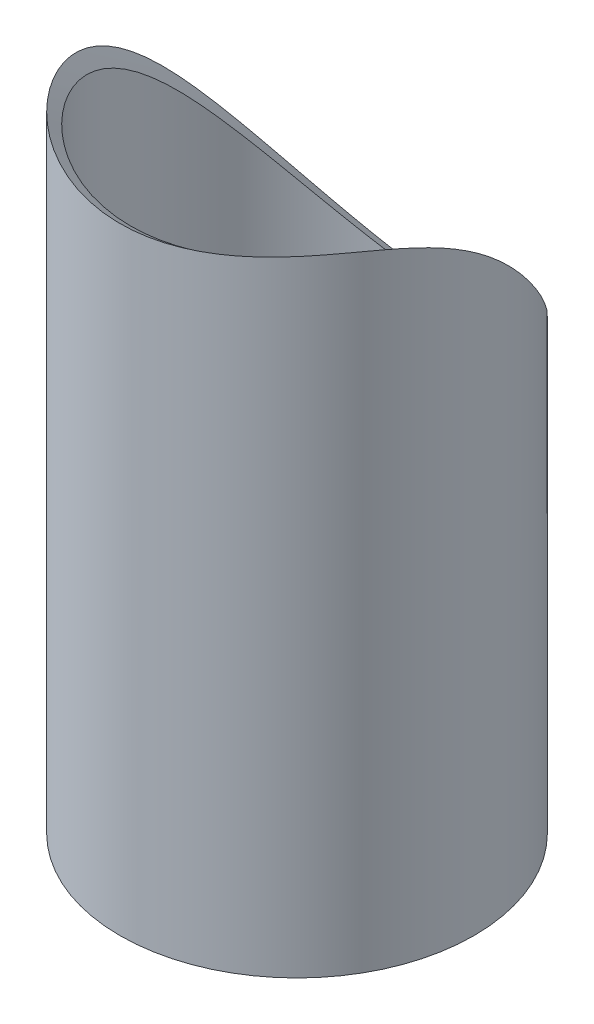
ISO-10303-21;
HEADER;
FILE_DESCRIPTION(('STEP AP214'),'2;1');
FILE_NAME('part.step','',(''),(''),'','','');
FILE_SCHEMA(('AUTOMOTIVE_DESIGN { 1 0 10303 214 1 1 1 1 }'));
ENDSEC;
DATA;
#1=APPLICATION_CONTEXT('core data for automotive mechanical design processes');
#2=APPLICATION_PROTOCOL_DEFINITION('international standard','automotive_design',2000,#1);
#3=PRODUCT_CONTEXT('',#1,'mechanical');
#4=PRODUCT('Part','Part','',(#3));
#5=PRODUCT_RELATED_PRODUCT_CATEGORY('part','',(#4));
#6=PRODUCT_DEFINITION_FORMATION('','',#4);
#7=PRODUCT_DEFINITION_CONTEXT('part definition',#1,'design');
#8=PRODUCT_DEFINITION('design','',#6,#7);
#9=PRODUCT_DEFINITION_SHAPE('','',#8);
#10=(LENGTH_UNIT() NAMED_UNIT(*) SI_UNIT(.MILLI.,.METRE.));
#11=(NAMED_UNIT(*) PLANE_ANGLE_UNIT() SI_UNIT($,.RADIAN.));
#12=(NAMED_UNIT(*) SI_UNIT($,.STERADIAN.) SOLID_ANGLE_UNIT());
#13=UNCERTAINTY_MEASURE_WITH_UNIT(LENGTH_MEASURE(1.E-05),#10,'distance_accuracy_value','');
#14=(GEOMETRIC_REPRESENTATION_CONTEXT(3) GLOBAL_UNCERTAINTY_ASSIGNED_CONTEXT((#13)) GLOBAL_UNIT_ASSIGNED_CONTEXT((#10,
#11,#12)) REPRESENTATION_CONTEXT('',''));
#15=CARTESIAN_POINT('',(0.,0.,0.));
#16=DIRECTION('',(0.,0.,1.));
#17=DIRECTION('',(1.,0.,0.));
#18=AXIS2_PLACEMENT_3D('',#15,#16,#17);
#19=CARTESIAN_POINT('',(0.,0.,0.));
#20=DIRECTION('',(0.,1.,0.));
#21=DIRECTION('',(0.,0.,1.));
#22=AXIS2_PLACEMENT_3D('',#19,#20,#21);
#23=PLANE('',#22);
#24=CARTESIAN_POINT('',(0.,0.,0.));
#25=DIRECTION('',(0.,1.,0.));
#26=DIRECTION('',(0.,0.,1.));
#27=AXIS2_PLACEMENT_3D('',#24,#25,#26);
#28=CIRCLE('',#27,50.);
#29=CARTESIAN_POINT('',(0.,0.,50.));
#30=VERTEX_POINT('',#29);
#31=EDGE_CURVE('E57',#30,#30,#28,.T.);
#32=ORIENTED_EDGE('',*,*,#31,.F.);
#33=EDGE_LOOP('',(#32));
#34=FACE_BOUND('',#33,.T.);
#35=CARTESIAN_POINT('',(0.,0.,0.));
#36=DIRECTION('',(0.,1.,0.));
#37=DIRECTION('',(1.,0.,0.));
#38=AXIS2_PLACEMENT_3D('',#35,#36,#37);
#39=CIRCLE('',#38,47.);
#40=CARTESIAN_POINT('',(47.,0.,0.));
#41=VERTEX_POINT('',#40);
#42=EDGE_CURVE('E91',#41,#41,#39,.T.);
#43=ORIENTED_EDGE('',*,*,#42,.T.);
#44=EDGE_LOOP('',(#43));
#45=FACE_BOUND('',#44,.T.);
#46=ADVANCED_FACE('F78',(#34,#45),#23,.F.);
#47=CARTESIAN_POINT('',(0.,200.,0.));
#48=DIRECTION('',(0.,-1.,0.));
#49=DIRECTION('',(0.,0.,-1.));
#50=AXIS2_PLACEMENT_3D('',#47,#48,#49);
#51=CYLINDRICAL_SURFACE('',#50,50.);
#52=CARTESIAN_POINT('',(0.,104.15792620832,-50.));
#53=CARTESIAN_POINT('',(0.788806087620831,104.157933799452,-49.9999955417674));
#54=CARTESIAN_POINT('',(1.57769231507761,104.188336058884,-49.9812892722332));
#55=CARTESIAN_POINT('',(3.14911275591625,104.309131673315,-49.9069348279691));
#56=CARTESIAN_POINT('',(3.93164621656736,104.399532035348,-49.8512823383784));
#57=CARTESIAN_POINT('',(5.48516003386601,104.638045510306,-49.704349147488));
#58=CARTESIAN_POINT('',(6.25612921699846,104.786211120958,-49.6130360372744));
#59=CARTESIAN_POINT('',(7.78082200161067,105.136617433011,-49.3968826605339));
#60=CARTESIAN_POINT('',(8.53454404154594,105.33886300991,-49.2720393711394));
#61=CARTESIAN_POINT('',(10.1952066274927,105.846289607741,-48.9584435091409));
#62=CARTESIAN_POINT('',(11.0966452274474,106.164486821358,-48.7615697936143));
#63=CARTESIAN_POINT('',(12.8625437496132,106.867499993301,-48.3257994361202));
#64=CARTESIAN_POINT('',(13.726994358212,107.252332608803,-48.0868922866094));
#65=CARTESIAN_POINT('',(15.4174811957132,108.080108257023,-47.571873890137));
#66=CARTESIAN_POINT('',(16.24346212476,108.523131646166,-47.2957111819302));
#67=CARTESIAN_POINT('',(17.8548987521452,109.458420523302,-46.7112129541796));
#68=CARTESIAN_POINT('',(18.6403523647394,109.950688541853,-46.4028757812355));
#69=CARTESIAN_POINT('',(20.5989758577776,111.263773647704,-45.5780501947243));
#70=CARTESIAN_POINT('',(21.7437560487012,112.114568236229,-45.0414667163745));
#71=CARTESIAN_POINT('',(23.39149036538,113.449130852108,-44.1952436385972));
#72=CARTESIAN_POINT('',(23.9293665131367,113.903909807969,-43.9061523277612));
#73=CARTESIAN_POINT('',(24.9829274408408,114.830716244766,-43.3153329849873));
#74=CARTESIAN_POINT('',(25.4986129229226,115.302743179085,-43.0136053534718));
#75=CARTESIAN_POINT('',(26.5096403489486,116.262874123129,-42.3979956931459));
#76=CARTESIAN_POINT('',(27.0049375673057,116.751009643886,-42.0840896013979));
#77=CARTESIAN_POINT('',(27.9749157834355,117.740561603372,-41.4456399895234));
#78=CARTESIAN_POINT('',(28.4495968455875,118.241978000619,-41.1210965026203));
#79=CARTESIAN_POINT('',(29.8438884402143,119.763515461215,-40.1327950505358));
#80=CARTESIAN_POINT('',(30.7340148415765,120.801181475351,-39.4542018023888));
#81=CARTESIAN_POINT('',(32.3460160725744,122.793786049916,-38.1404180357073));
#82=CARTESIAN_POINT('',(33.0755707246591,123.744980302077,-37.5088738251481));
#83=CARTESIAN_POINT('',(34.4815649600617,125.669560713067,-36.2205871664935));
#84=CARTESIAN_POINT('',(35.1579960980747,126.642950368797,-35.5638407364827));
#85=CARTESIAN_POINT('',(36.4614548483428,128.607339664232,-34.2262319568102));
#86=CARTESIAN_POINT('',(37.0884461936335,129.598351589709,-33.5453524251617));
#87=CARTESIAN_POINT('',(38.2953144038239,131.59286029552,-32.1607252099585));
#88=CARTESIAN_POINT('',(38.8751936272657,132.59635644796,-31.4569786736515));
#89=CARTESIAN_POINT('',(39.9911134663435,134.613624965565,-30.025584770355));
#90=CARTESIAN_POINT('',(40.5270797293347,135.627411621375,-29.2978996754105));
#91=CARTESIAN_POINT('',(41.5559132675181,137.659975256035,-27.8193679472551));
#92=CARTESIAN_POINT('',(42.0487795070729,138.678752354178,-27.0685207580752));
#93=CARTESIAN_POINT('',(42.9924310681288,140.717195304658,-25.5431937559186));
#94=CARTESIAN_POINT('',(43.4432370654812,141.73686046896,-24.7687258054707));
#95=CARTESIAN_POINT('',(44.3037488713321,143.773922794198,-23.1944523523802));
#96=CARTESIAN_POINT('',(44.7134566349924,144.79132006077,-22.3946480574448));
#97=CARTESIAN_POINT('',(45.3888867995645,146.551540742501,-20.9830514959319));
#98=CARTESIAN_POINT('',(45.6640218938514,147.295781946774,-20.3775109744298));
#99=CARTESIAN_POINT('',(46.1919351731326,148.779240456074,-19.1507466561188));
#100=CARTESIAN_POINT('',(46.4447139779447,149.518457899858,-18.5295232947235));
#101=CARTESIAN_POINT('',(46.9275691619725,150.990168125668,-17.2701518610891));
#102=CARTESIAN_POINT('',(47.1576406229409,151.722659419834,-16.6320001601032));
#103=CARTESIAN_POINT('',(47.5943613731987,153.178646023309,-15.3376435308361));
#104=CARTESIAN_POINT('',(47.8010106970172,153.902141345878,-14.6814386291709));
#105=CARTESIAN_POINT('',(48.1894229180066,155.335822180042,-13.3513396435347));
#106=CARTESIAN_POINT('',(48.3712503302447,156.046037888753,-12.6774970594271));
#107=CARTESIAN_POINT('',(48.7093929756601,157.452383031288,-11.3089302551525));
#108=CARTESIAN_POINT('',(48.8657073105735,158.148511968392,-10.6142053007789));
#109=CARTESIAN_POINT('',(49.1510873661007,159.523120913622,-9.2026552328283));
#110=CARTESIAN_POINT('',(49.2801661243535,160.201609229287,-8.48584088261945));
#111=CARTESIAN_POINT('',(49.5090519904965,161.53744413393,-7.02835855782333));
#112=CARTESIAN_POINT('',(49.6088628406405,162.194793416209,-6.28769364626892));
#113=CARTESIAN_POINT('',(49.7942865069198,163.619513155911,-4.6228204573585));
#114=CARTESIAN_POINT('',(49.8725220162403,164.381016526795,-3.69271790489871));
#115=CARTESIAN_POINT('',(49.9768594018136,165.858006820847,-1.79372269889005));
#116=CARTESIAN_POINT('',(50.0029658974672,166.573497815953,-0.824833490174102));
#117=CARTESIAN_POINT('',(49.9965035140777,167.947544066395,1.15059307381174));
#118=CARTESIAN_POINT('',(49.964015647843,168.606176615354,2.15707656720963));
#119=CARTESIAN_POINT('',(49.8332790523246,169.857092745435,4.20688215490948));
#120=CARTESIAN_POINT('',(49.7350319027653,170.449377920011,5.25020336369482));
#121=CARTESIAN_POINT('',(49.5321462920375,171.284226205382,6.8453956539696));
#122=CARTESIAN_POINT('',(49.4545298247245,171.555265654746,7.38601402107492));
#123=CARTESIAN_POINT('',(49.2797586831858,172.076634705024,8.47400719187578));
#124=CARTESIAN_POINT('',(49.1826065851463,172.326967030473,9.02138109578683));
#125=CARTESIAN_POINT('',(48.9680158406607,172.806067434162,10.1216415869975));
#126=CARTESIAN_POINT('',(48.8505748748339,173.034833042313,10.6745287977501));
#127=CARTESIAN_POINT('',(48.5948363482654,173.470126669494,11.7841406102277));
#128=CARTESIAN_POINT('',(48.4565416246534,173.676657706971,12.3408646801351));
#129=CARTESIAN_POINT('',(48.158665202145,174.067183079907,13.4564570766135));
#130=CARTESIAN_POINT('',(47.9990855855498,174.251179616543,14.0153251882449));
#131=CARTESIAN_POINT('',(47.6583943947968,174.596656756226,15.1333715890338));
#132=CARTESIAN_POINT('',(47.4772855057717,174.758140161665,15.6925498308713));
#133=CARTESIAN_POINT('',(47.0934292139373,175.058971698856,16.8094488369214));
#134=CARTESIAN_POINT('',(46.8906814123529,175.198319422559,17.36716957408));
#135=CARTESIAN_POINT('',(46.4636673191188,175.455534327552,18.4792468843422));
#136=CARTESIAN_POINT('',(46.2394017388811,175.573402218625,19.0336035680229));
#137=CARTESIAN_POINT('',(45.6073942182718,175.862835140424,20.518090769718));
#138=CARTESIAN_POINT('',(45.179813391309,176.015345571765,21.4436163002726));
#139=CARTESIAN_POINT('',(44.265726160029,176.267474479688,23.2721019005952));
#140=CARTESIAN_POINT('',(43.7792274382782,176.367099843088,24.1750648939097));
#141=CARTESIAN_POINT('',(42.7494105231099,176.520554029561,25.9527199456142));
#142=CARTESIAN_POINT('',(42.2060559292245,176.574353309765,26.8273934175326));
#143=CARTESIAN_POINT('',(41.065612392493,176.643370089826,28.5425375466609));
#144=CARTESIAN_POINT('',(40.4685185781078,176.658584088215,29.3830050930041));
#145=CARTESIAN_POINT('',(39.1577623322847,176.657556498294,31.1121783427853));
#146=CARTESIAN_POINT('',(38.4384491988533,176.637821602075,31.9965983989527));
#147=CARTESIAN_POINT('',(36.9417541202431,176.569008510519,33.7135602342094));
#148=CARTESIAN_POINT('',(36.1643699136105,176.519929171904,34.5460999906131));
#149=CARTESIAN_POINT('',(34.5552460844355,176.400540001356,36.1556391192293));
#150=CARTESIAN_POINT('',(33.723492254225,176.330224602577,36.9326238620515));
#151=CARTESIAN_POINT('',(32.009695445504,176.175527609188,38.4274984498727));
#152=CARTESIAN_POINT('',(31.1276489682791,176.091145035177,39.145384175013));
#153=CARTESIAN_POINT('',(29.1496540077315,175.898230000062,40.6461617693853));
#154=CARTESIAN_POINT('',(28.0443169432404,175.788117504747,41.4165186127912));
#155=CARTESIAN_POINT('',(25.775186410359,175.565788472139,42.8655142224368));
#156=CARTESIAN_POINT('',(24.6113869072692,175.453571718389,43.5441434934378));
#157=CARTESIAN_POINT('',(22.232020529706,175.234362612027,44.8057018928394));
#158=CARTESIAN_POINT('',(21.0164365353331,175.127372012668,45.3885990581966));
#159=CARTESIAN_POINT('',(18.5413788067582,174.924712175895,46.4546328392111));
#160=CARTESIAN_POINT('',(17.2819052064127,174.829042903957,46.9377697590904));
#161=CARTESIAN_POINT('',(14.6687793912857,174.649891362488,47.8206467640988));
#162=CARTESIAN_POINT('',(13.3134501198881,174.567162319319,48.2155880653107));
#163=CARTESIAN_POINT('',(10.5730948478505,174.423629766525,48.8896793999988));
#164=CARTESIAN_POINT('',(9.18806768094115,174.362827119651,49.1688248772529));
#165=CARTESIAN_POINT('',(6.39864475393267,174.266101012014,49.6089782747489));
#166=CARTESIAN_POINT('',(4.99425111286183,174.230174851017,49.7699990170195));
#167=CARTESIAN_POINT('',(2.17647112080676,174.184878279009,49.9725733513155));
#168=CARTESIAN_POINT('',(0.763085023084159,174.175507123396,50.0141302930977));
#169=CARTESIAN_POINT('',(-2.02989044626098,174.183654099159,49.9778505420562));
#170=CARTESIAN_POINT('',(-3.40951739897267,174.200565541333,49.9027076939287));
#171=CARTESIAN_POINT('',(-6.15727893492469,174.259406125772,49.6386224554472));
#172=CARTESIAN_POINT('',(-7.52541367240321,174.30133493173,49.4496815948703));
#173=CARTESIAN_POINT('',(-10.2403566387388,174.408313954667,48.9595527547789));
#174=CARTESIAN_POINT('',(-11.5871667915875,174.473362073165,48.6583749625988));
#175=CARTESIAN_POINT('',(-14.2502602057319,174.623537562984,47.9461144059484));
#176=CARTESIAN_POINT('',(-15.5665432520087,174.708665075687,47.5350308676081));
#177=CARTESIAN_POINT('',(-18.159388433091,174.894745439868,46.6061478583257));
#178=CARTESIAN_POINT('',(-19.4359580369043,174.995695293768,46.088368595287));
#179=CARTESIAN_POINT('',(-21.9414785184774,175.207999037452,44.9495781307964));
#180=CARTESIAN_POINT('',(-23.1704291938378,175.319352971451,44.3285664906252));
#181=CARTESIAN_POINT('',(-24.9723104114524,175.4890608978,43.322718261401));
#182=CARTESIAN_POINT('',(-25.5662976086193,175.546105332983,42.9748560712548));
#183=CARTESIAN_POINT('',(-26.7394020536535,175.660073504937,42.2549144486351));
#184=CARTESIAN_POINT('',(-27.3185206290451,175.716997252064,41.8828371887298));
#185=CARTESIAN_POINT('',(-28.4610320415076,175.82964780203,41.1150031680542));
#186=CARTESIAN_POINT('',(-29.0244232992112,175.885374484529,40.7192440415614));
#187=CARTESIAN_POINT('',(-30.1344867859855,175.994427048264,39.9047186341754));
#188=CARTESIAN_POINT('',(-30.6811605208082,176.047753145926,39.4859544349133));
#189=CARTESIAN_POINT('',(-31.7704653717313,176.151998764686,38.6152281566903));
#190=CARTESIAN_POINT('',(-32.3126504725804,176.202824262844,38.1626965841549));
#191=CARTESIAN_POINT('',(-33.3775875371785,176.299049127431,37.2348672374074));
#192=CARTESIAN_POINT('',(-33.9003414163442,176.344449029666,36.7595717177592));
#193=CARTESIAN_POINT('',(-34.9256588464126,176.428166503419,35.7868388609664));
#194=CARTESIAN_POINT('',(-35.4282176501832,176.466482417282,35.2893963751286));
#195=CARTESIAN_POINT('',(-36.4120218220591,176.534198885178,34.2733809743902));
#196=CARTESIAN_POINT('',(-36.8932696226555,176.563600458968,33.7548104841338));
#197=CARTESIAN_POINT('',(-37.8331124029048,176.611511102404,32.6979383670322));
#198=CARTESIAN_POINT('',(-38.2917289690973,176.6300307431,32.1596564304417));
#199=CARTESIAN_POINT('',(-39.1858033631913,176.654128284653,31.0640098955909));
#200=CARTESIAN_POINT('',(-39.6212640716302,176.659707798932,30.5066476851206));
#201=CARTESIAN_POINT('',(-40.4680442219523,176.655713309581,29.3740895941959));
#202=CARTESIAN_POINT('',(-40.8793689972355,176.646142666911,28.798897696888));
#203=CARTESIAN_POINT('',(-41.6769751152365,176.609549488259,27.6320339520034));
#204=CARTESIAN_POINT('',(-42.0632583877819,176.58252829887,27.0403633793947));
#205=CARTESIAN_POINT('',(-42.997024600386,176.49015025434,25.5416952014008));
#206=CARTESIAN_POINT('',(-43.5283014174462,176.412369094249,24.6252405389186));
#207=CARTESIAN_POINT('',(-44.52930726066,176.204255054766,22.7652390312741));
#208=CARTESIAN_POINT('',(-44.9990466216235,176.073931014633,21.8216967678291));
#209=CARTESIAN_POINT('',(-45.8739749929697,175.753845473489,19.9167021747052));
#210=CARTESIAN_POINT('',(-46.279266211031,175.564179529132,18.9552809596444));
#211=CARTESIAN_POINT('',(-47.0246688176025,175.119881244027,17.0221523589143));
#212=CARTESIAN_POINT('',(-47.3647798580827,174.865248556405,16.050444918351));
#213=CARTESIAN_POINT('',(-47.980394126267,174.287331559031,14.1041203176234));
#214=CARTESIAN_POINT('',(-48.2557366883598,173.96388024059,13.1295018707028));
#215=CARTESIAN_POINT('',(-48.7421591787028,173.248739956459,11.1893837401412));
#216=CARTESIAN_POINT('',(-48.9532403686805,172.857052330778,10.2238838778237));
#217=CARTESIAN_POINT('',(-49.3142949301225,172.008130089865,8.30964000438002));
#218=CARTESIAN_POINT('',(-49.4642196716415,171.550843701282,7.3609098993181));
#219=CARTESIAN_POINT('',(-49.7069730390854,170.576230413691,5.48722368023473));
#220=CARTESIAN_POINT('',(-49.7997935208653,170.058894963054,4.56227097533584));
#221=CARTESIAN_POINT('',(-49.9119917570652,169.144041827953,3.03008881831061));
#222=CARTESIAN_POINT('',(-49.9453346095449,168.76068915094,2.41529626403259));
#223=CARTESIAN_POINT('',(-49.9893142396565,167.97151571866,1.19939035912804));
#224=CARTESIAN_POINT('',(-49.9999489738231,167.565692944717,0.598278244396247));
#225=CARTESIAN_POINT('',(-50.0000506838378,166.733804959446,-0.589989158168888));
#226=CARTESIAN_POINT('',(-49.9895112502026,166.307733656945,-1.17714016549689));
#227=CARTESIAN_POINT('',(-49.9487128949025,165.43765443935,-2.33730925430218));
#228=CARTESIAN_POINT('',(-49.918452932714,164.993645578968,-2.91032658838194));
#229=CARTESIAN_POINT('',(-49.8394343531396,164.088452824575,-4.04409123021243));
#230=CARTESIAN_POINT('',(-49.7906209450293,163.627221744727,-4.60479694163562));
#231=CARTESIAN_POINT('',(-49.6757159614263,162.690776253443,-5.71255845651443));
#232=CARTESIAN_POINT('',(-49.6096244656777,162.215561906555,-6.25961432295588));
#233=CARTESIAN_POINT('',(-49.4612388066453,161.252957551168,-7.34053459079268));
#234=CARTESIAN_POINT('',(-49.3789463392611,160.76556882173,-7.87440036633424));
#235=CARTESIAN_POINT('',(-49.1990729997471,159.780137617634,-8.92959032602035));
#236=CARTESIAN_POINT('',(-49.101491261546,159.282094540835,-9.4509137977666));
#237=CARTESIAN_POINT('',(-48.8044539853181,157.857743836768,-10.9112748779076));
#238=CARTESIAN_POINT('',(-48.5878854620181,156.920523097241,-11.8362530444803));
#239=CARTESIAN_POINT('',(-48.1098723689423,155.022600416263,-13.649892809029));
#240=CARTESIAN_POINT('',(-47.8484196474602,154.061894236699,-14.5385477737546));
#241=CARTESIAN_POINT('',(-47.2830446815783,152.122482575444,-16.2835951595358));
#242=CARTESIAN_POINT('',(-46.9790897020511,151.143763729842,-17.1399620607397));
#243=CARTESIAN_POINT('',(-46.3305417966132,149.174253229564,-18.8226945375659));
#244=CARTESIAN_POINT('',(-45.9859512503074,148.183462284871,-19.6490618662504));
#245=CARTESIAN_POINT('',(-45.2563227658295,146.192367647275,-21.2758380681332));
#246=CARTESIAN_POINT('',(-44.8712145439872,145.192050255892,-22.0761985742574));
#247=CARTESIAN_POINT('',(-44.0612177361305,143.187493026138,-23.651500785595));
#248=CARTESIAN_POINT('',(-43.6363282901163,142.183253103419,-24.4264419407975));
#249=CARTESIAN_POINT('',(-42.7465914990555,140.174971007157,-25.9520372834627));
#250=CARTESIAN_POINT('',(-42.2817653120078,139.170929007927,-26.7027040445835));
#251=CARTESIAN_POINT('',(-41.3110213248911,137.165954775929,-28.1812282332321));
#252=CARTESIAN_POINT('',(-40.8051051037909,136.1650224252,-28.9090865357334));
#253=CARTESIAN_POINT('',(-39.8573266151665,134.371449473718,-30.1976353807184));
#254=CARTESIAN_POINT('',(-39.4231984363978,133.577617329488,-30.7623675216591));
#255=CARTESIAN_POINT('',(-38.5268773557228,131.99592783708,-31.877760862639));
#256=CARTESIAN_POINT('',(-38.0646848859339,131.208070397116,-32.4284222791457));
#257=CARTESIAN_POINT('',(-37.1109334967901,129.640054234845,-33.5156934619511));
#258=CARTESIAN_POINT('',(-36.6193665374846,128.859897689023,-34.0522993228312));
#259=CARTESIAN_POINT('',(-35.6056045232438,127.309636889387,-35.1109391444172));
#260=CARTESIAN_POINT('',(-35.083409630134,126.539532582486,-35.6329731820932));
#261=CARTESIAN_POINT('',(-34.0086251729488,125.014348983232,-36.6601159277301));
#262=CARTESIAN_POINT('',(-33.4561445573297,124.259227632373,-37.1652759775506));
#263=CARTESIAN_POINT('',(-32.3173764257223,122.76400646528,-38.1596464419038));
#264=CARTESIAN_POINT('',(-31.7310874765318,122.023907287667,-38.648856178893));
#265=CARTESIAN_POINT('',(-30.5230962977053,120.562334056215,-39.6097957567908));
#266=CARTESIAN_POINT('',(-29.9014154451542,119.840849133988,-40.0815358711885));
#267=CARTESIAN_POINT('',(-28.6202541200722,118.419844443168,-41.0061585794417));
#268=CARTESIAN_POINT('',(-27.960779398865,117.720321357452,-41.4590440245136));
#269=CARTESIAN_POINT('',(-26.5581268616089,116.303557433448,-42.3722840367263));
#270=CARTESIAN_POINT('',(-25.8122932482909,115.588047122757,-42.8312621593159));
#271=CARTESIAN_POINT('',(-24.2722732520713,114.193081631025,-43.7223986441013));
#272=CARTESIAN_POINT('',(-23.4780878860845,113.513625692264,-44.1545575699622));
#273=CARTESIAN_POINT('',(-21.8388098184927,112.198625252701,-44.9879058380867));
#274=CARTESIAN_POINT('',(-20.993726853853,111.56307240265,-45.3891010705667));
#275=CARTESIAN_POINT('',(-19.2504238350986,110.345189712321,-46.1554691424544));
#276=CARTESIAN_POINT('',(-18.3522145814093,109.762849114987,-46.5206492636404));
#277=CARTESIAN_POINT('',(-16.681878620467,108.769710059467,-47.1417728119527));
#278=CARTESIAN_POINT('',(-15.9192542207723,108.347588058411,-47.4051411682928));
#279=CARTESIAN_POINT('',(-14.3592073488131,107.551738597144,-47.9007598294011));
#280=CARTESIAN_POINT('',(-13.5617849094215,107.178011091218,-48.1330101635648));
#281=CARTESIAN_POINT('',(-11.9352405395693,106.486829917404,-48.5618795440931));
#282=CARTESIAN_POINT('',(-11.1061761050351,106.169279584881,-48.7585598095052));
#283=CARTESIAN_POINT('',(-9.41843016740397,105.597170250391,-49.1124805336938));
#284=CARTESIAN_POINT('',(-8.5597581881127,105.342591204013,-49.269733542792));
#285=CARTESIAN_POINT('',(-7.06570937799992,104.965823603158,-49.5022625527628));
#286=CARTESIAN_POINT('',(-6.4362358136836,104.826572353204,-49.5881348951697));
#287=CARTESIAN_POINT('',(-5.16736797707175,104.586089236067,-49.7363655019608));
#288=CARTESIAN_POINT('',(-4.52797534067521,104.484851167553,-49.7987276017268));
#289=CARTESIAN_POINT('',(-3.24231868441363,104.322141609754,-49.8989279916738));
#290=CARTESIAN_POINT('',(-2.59605571599866,104.260664122002,-49.9367699810735));
#291=CARTESIAN_POINT('',(-1.29988030652069,104.17855038617,-49.9873096121059));
#292=CARTESIAN_POINT('',(-0.649967359031493,104.157919953313,-50.0000036735336));
#293=CARTESIAN_POINT('',(0.,104.15792620832,-50.));
#294=B_SPLINE_CURVE_WITH_KNOTS('',3,(#52,#53,#54,#55,#56,#57,#58,#59,#60,#61,#62,#63,#64,#65,
#66,#67,#68,#69,#70,#71,#72,#73,#74,#75,#76,#77,#78,#79,#80,#81,#82,#83,#84,#85,#86,#87,#88,#89,
#90,#91,#92,#93,#94,#95,#96,#97,#98,#99,#100,#101,#102,#103,#104,#105,#106,#107,#108,#109,#110,
#111,#112,#113,#114,#115,#116,#117,#118,#119,#120,#121,#122,#123,#124,#125,#126,#127,#128,#129,
#130,#131,#132,#133,#134,#135,#136,#137,#138,#139,#140,#141,#142,#143,#144,#145,#146,#147,#148,
#149,#150,#151,#152,#153,#154,#155,#156,#157,#158,#159,#160,#161,#162,#163,#164,#165,#166,#167,
#168,#169,#170,#171,#172,#173,#174,#175,#176,#177,#178,#179,#180,#181,#182,#183,#184,#185,#186,
#187,#188,#189,#190,#191,#192,#193,#194,#195,#196,#197,#198,#199,#200,#201,#202,#203,#204,#205,
#206,#207,#208,#209,#210,#211,#212,#213,#214,#215,#216,#217,#218,#219,#220,#221,#222,#223,#224,
#225,#226,#227,#228,#229,#230,#231,#232,#233,#234,#235,#236,#237,#238,#239,#240,#241,#242,#243,
#244,#245,#246,#247,#248,#249,#250,#251,#252,#253,#254,#255,#256,#257,#258,#259,#260,#261,#262,
#263,#264,#265,#266,#267,#268,#269,#270,#271,#272,#273,#274,#275,#276,#277,#278,#279,#280,#281,
#282,#283,#284,#285,#286,#287,#288,#289,#290,#291,#292,#293),.UNSPECIFIED.,.T.,.F.,(4,2,2,2,2,2,
2,2,2,2,2,2,2,2,2,2,2,2,2,2,2,2,2,2,2,2,2,2,2,2,2,2,2,2,2,2,2,2,2,2,2,2,2,2,2,2,2,2,2,2,2,2,2,2,
2,2,2,2,2,2,2,2,2,2,2,2,2,2,2,2,2,2,2,2,2,2,2,2,2,2,2,2,2,2,2,2,2,2,2,2,2,2,2,2,2,2,2,2,2,2,2,2,
2,2,2,2,2,2,2,2,2,2,2,2,2,2,2,2,2,2,4),(0.,2.36576060984382,4.73179755983265,7.0999898229868,
9.46839565899208,12.3920072103036,15.3163506489009,18.2447756634522,21.1733512398045,
25.7371101218974,28.0208426897181,30.3045029448061,32.5929314848319,34.881352878129,
39.4569816899446,43.5203448943063,47.5843527692526,51.6513146204056,55.7180727444019,
59.791580144266,63.865185398341,67.9367774927602,72.0081757978183,75.0022318932966,
77.9962049539127,80.990825070963,83.9854407732407,86.9721185749402,89.9589015088547,
92.9442514131303,95.9292194379523,99.5407148006307,103.151890117263,106.75807643476,
110.364176124551,112.192740872776,114.021064644009,115.849597563835,117.677881937933,
119.505987581966,121.333865463237,123.161777035563,124.989628195031,128.078507454486,
131.166984374029,134.257450849636,137.348197763284,140.765500604298,144.182936594313,
147.601269213914,151.019839927879,155.070701756887,159.12198259285,163.17461333299,
167.227231714319,171.464371931973,175.701678852708,179.938525760451,184.17525386614,
188.315627133765,192.455944743945,196.595886644188,200.735857695425,204.875045365994,
209.014250627826,211.08590909915,213.157381957509,215.229062094204,217.300555081175,
219.424051462922,221.547337964649,223.671120689002,225.794660371339,227.916133756069,
230.037342613844,232.158080961825,234.278655679984,237.461729105481,240.644267267603,
243.821706823993,246.999163345864,250.184420694795,253.369615499365,256.557338169991,
259.745515364695,261.920583701722,264.095847761236,266.271770378834,268.447807814962,
270.630321937486,272.812825987157,274.995101696104,277.177501066274,281.17916799025,
285.181562452909,289.187056704844,293.192316512766,297.20464228627,301.217054819203,
305.227354580132,309.237500309917,312.436751932924,315.635954308203,318.836036368537,
322.036101522462,325.225326998846,328.414687772339,331.602142166148,334.789112786962,
338.180014788223,341.570845497997,344.961029572736,348.350526785844,351.080070978868,
353.809612593421,356.534410780784,359.258340517288,361.208035597993,363.157412474232,
365.106495189827,367.055855368219),.UNSPECIFIED.);
#295=CARTESIAN_POINT('',(0.,104.15792620832,-50.));
#296=VERTEX_POINT('',#295);
#297=EDGE_CURVE('E96',#296,#296,#294,.T.);
#298=ORIENTED_EDGE('',*,*,#297,.T.);
#299=EDGE_LOOP('',(#298));
#300=FACE_BOUND('',#299,.T.);
#301=ORIENTED_EDGE('',*,*,#31,.T.);
#302=EDGE_LOOP('',(#301));
#303=FACE_BOUND('',#302,.T.);
#304=ADVANCED_FACE('F85',(#300,#303),#51,.T.);
#305=CARTESIAN_POINT('',(0.,200.,0.));
#306=DIRECTION('',(0.,-1.,0.));
#307=DIRECTION('',(0.,0.,-1.));
#308=AXIS2_PLACEMENT_3D('',#305,#306,#307);
#309=CYLINDRICAL_SURFACE('',#308,47.);
#310=CARTESIAN_POINT('',(0.,106.25854882295,-47.));
#311=CARTESIAN_POINT('',(0.758875423841747,106.258543044184,-47.0000034847539));
#312=CARTESIAN_POINT('',(1.51770549365743,106.287459578877,-46.9815830936117));
#313=CARTESIAN_POINT('',(3.02918627871136,106.402313493078,-46.9083832245413));
#314=CARTESIAN_POINT('',(3.78183754870207,106.488245695579,-46.8536070477087));
#315=CARTESIAN_POINT('',(5.27590615461316,106.714958523195,-46.7089777788858));
#316=CARTESIAN_POINT('',(6.01731507165036,106.855778329209,-46.6190996296554));
#317=CARTESIAN_POINT('',(7.48364187791328,107.188830992194,-46.4062956209255));
#318=CARTESIAN_POINT('',(8.20855744557102,107.381071038979,-46.2833651398849));
#319=CARTESIAN_POINT('',(9.80489384451881,107.86314975413,-45.9746659087148));
#320=CARTESIAN_POINT('',(10.6710660715687,108.165293607449,-45.7809287651349));
#321=CARTESIAN_POINT('',(12.3679427989925,108.832835642297,-45.3519635986493));
#322=CARTESIAN_POINT('',(13.1986389161469,109.198248672734,-45.1167258355445));
#323=CARTESIAN_POINT('',(14.8231143906865,109.984255599701,-44.6094205384635));
#324=CARTESIAN_POINT('',(15.6168419915678,110.404923884676,-44.3373033388503));
#325=CARTESIAN_POINT('',(17.165324253112,111.293029686493,-43.7611051390066));
#326=CARTESIAN_POINT('',(17.9200767077926,111.760469846221,-43.4570223324824));
#327=CARTESIAN_POINT('',(19.7940701674992,113.002056797601,-42.6466135161116));
#328=CARTESIAN_POINT('',(20.8865952241632,113.803993299434,-42.1207190350094));
#329=CARTESIAN_POINT('',(22.4591896154082,115.061546374397,-41.2908741056817));
#330=CARTESIAN_POINT('',(22.9725466188283,115.490020163247,-41.0073042599329));
#331=CARTESIAN_POINT('',(23.9780403944887,116.363087997732,-40.4275923085119));
#332=CARTESIAN_POINT('',(24.4701778201027,116.807681546245,-40.1314505904992));
#333=CARTESIAN_POINT('',(25.9179293223402,118.164473072086,-39.2244922274543));
#334=CARTESIAN_POINT('',(26.8427916616511,119.097988570044,-38.5962574900727));
#335=CARTESIAN_POINT('',(28.6164252632203,121.007964975906,-37.3002197543856));
#336=CARTESIAN_POINT('',(29.4652041069348,121.984421590391,-36.6324207095651));
#337=CARTESIAN_POINT('',(30.9806487358947,123.833437596236,-35.3559149428274));
#338=CARTESIAN_POINT('',(31.656299377512,124.701794608244,-34.7517291143477));
#339=CARTESIAN_POINT('',(32.958869011394,126.457673107473,-33.5189088943861));
#340=CARTESIAN_POINT('',(33.5857808441917,127.345197385885,-32.89027093129));
#341=CARTESIAN_POINT('',(34.7939675734967,129.135303079014,-31.6094190417952));
#342=CARTESIAN_POINT('',(35.3752109438404,130.037894382697,-30.9571892751488));
#343=CARTESIAN_POINT('',(36.493876017911,131.853496806358,-29.6302214575146));
#344=CARTESIAN_POINT('',(37.0312997508615,132.766507441598,-28.9554844508457));
#345=CARTESIAN_POINT('',(38.0649257577193,134.600680003607,-27.5826170016003));
#346=CARTESIAN_POINT('',(38.5610679152081,135.521851728871,-26.8844544506659));
#347=CARTESIAN_POINT('',(39.5126354351384,137.367661332331,-25.4653005168851));
#348=CARTESIAN_POINT('',(39.9680598149764,138.292299293613,-24.744308583687));
#349=CARTESIAN_POINT('',(40.8388231674038,140.141227095759,-23.2790988634767));
#350=CARTESIAN_POINT('',(41.2541810876725,141.065516893227,-22.534892277368));
#351=CARTESIAN_POINT('',(42.0453770208161,142.910743301394,-21.0217790707386));
#352=CARTESIAN_POINT('',(42.4212170474391,143.831680080644,-20.2528737114242));
#353=CARTESIAN_POINT('',(43.0409338731663,145.428922034043,-18.8913522181881));
#354=CARTESIAN_POINT('',(43.2937774993708,146.106809715435,-18.3046558462995));
#355=CARTESIAN_POINT('',(43.7773026221931,147.457126195194,-17.1160585234335));
#356=CARTESIAN_POINT('',(44.0079847999528,148.129555160755,-16.5141580404798));
#357=CARTESIAN_POINT('',(44.4466982328725,149.467318673619,-15.2941592613782));
#358=CARTESIAN_POINT('',(44.6547254413864,150.132651934399,-14.6760580958362));
#359=CARTESIAN_POINT('',(45.0473071789681,151.454137591448,-13.4227914140235));
#360=CARTESIAN_POINT('',(45.231861717077,152.110289991253,-12.7876259043258));
#361=CARTESIAN_POINT('',(45.5759934298986,153.409463991369,-11.5009196829512));
#362=CARTESIAN_POINT('',(45.7356360673891,154.052516008929,-10.8494272943413));
#363=CARTESIAN_POINT('',(46.0292050909342,155.324824840523,-9.52737145301814));
#364=CARTESIAN_POINT('',(46.1631306999261,155.954081237202,-8.85680742474112));
#365=CARTESIAN_POINT('',(46.4035432588379,157.19569895843,-7.49589486871992));
#366=CARTESIAN_POINT('',(46.5100419965524,157.808067439851,-6.80555498268156));
#367=CARTESIAN_POINT('',(46.6936381214816,159.012910591151,-5.40403192555332));
#368=CARTESIAN_POINT('',(46.7707388907036,159.605387542239,-4.69285116218692));
#369=CARTESIAN_POINT('',(46.9103065150236,160.929498861694,-3.04684665636245));
#370=CARTESIAN_POINT('',(46.9626468045499,161.65369917236,-2.10511227352963));
#371=CARTESIAN_POINT('',(47.0094276562105,163.055358827107,-0.18600571229314));
#372=CARTESIAN_POINT('',(47.003874311355,163.732823082366,0.791362705020982));
#373=CARTESIAN_POINT('',(46.9282935857182,165.031157514934,2.77904845762528));
#374=CARTESIAN_POINT('',(46.8583480903172,165.652098469272,3.7893223744701));
#375=CARTESIAN_POINT('',(46.6471247973509,166.829298350582,5.84013971742074));
#376=CARTESIAN_POINT('',(46.5058485322807,167.38555866686,6.88068249276726));
#377=CARTESIAN_POINT('',(46.2346670742823,168.168335857716,8.46447696777825));
#378=CARTESIAN_POINT('',(46.1336172806651,168.422004940979,8.99947623369609));
#379=CARTESIAN_POINT('',(45.910951733389,168.909943954395,10.0739952662216));
#380=CARTESIAN_POINT('',(45.7893385841046,169.144216335574,10.6135144521618));
#381=CARTESIAN_POINT('',(45.524937860091,169.592788669213,11.6957418663343));
#382=CARTESIAN_POINT('',(45.3821475637141,169.80708604875,12.2384504958455));
#383=CARTESIAN_POINT('',(45.0749820150999,170.215297559656,13.3253463343336));
#384=CARTESIAN_POINT('',(44.9106095546435,170.409214321547,13.8695333431722));
#385=CARTESIAN_POINT('',(44.5599590183053,170.776626503282,14.9578383586794));
#386=CARTESIAN_POINT('',(44.3736778879248,170.950119068828,15.5019563451134));
#387=CARTESIAN_POINT('',(43.9791377740172,171.276815588314,16.5882285189456));
#388=CARTESIAN_POINT('',(43.7708814106359,171.430021956113,17.130382932509));
#389=CARTESIAN_POINT('',(43.3324083705378,171.716624099999,18.2110503900843));
#390=CARTESIAN_POINT('',(43.1021913869262,171.850019599166,18.7495633830953));
#391=CARTESIAN_POINT('',(42.6200282849265,172.097689508959,19.8211645659637));
#392=CARTESIAN_POINT('',(42.3680828038058,172.211964480076,20.3542529144061));
#393=CARTESIAN_POINT('',(41.6532851282343,172.498142664832,21.7953692438544));
#394=CARTESIAN_POINT('',(41.1693366484629,172.652193934171,22.696618206285));
#395=CARTESIAN_POINT('',(40.1403968700594,172.912009399898,24.4703960623371));
#396=CARTESIAN_POINT('',(39.5954127579626,173.017779273668,25.3429283215372));
#397=CARTESIAN_POINT('',(38.4470422828152,173.187757325531,27.0533999023575));
#398=CARTESIAN_POINT('',(37.843630518992,173.251947333142,27.8913239505743));
#399=CARTESIAN_POINT('',(36.5819041139855,173.345569907321,29.5267898694311));
#400=CARTESIAN_POINT('',(35.9235848801693,173.374999563295,30.3243283531113));
#401=CARTESIAN_POINT('',(34.4925047530828,173.407244249259,31.9459162135175));
#402=CARTESIAN_POINT('',(33.7147876734668,173.407359583787,32.7656465010902));
#403=CARTESIAN_POINT('',(32.1025804409826,173.382337043868,34.3467521634286));
#404=CARTESIAN_POINT('',(31.2680882635931,173.357198268452,35.1081254552037));
#405=CARTESIAN_POINT('',(29.5466796818819,173.289037496894,36.5686769275149));
#406=CARTESIAN_POINT('',(28.659749426106,173.246010757401,37.2678385516404));
#407=CARTESIAN_POINT('',(26.8382785472131,173.148590854093,38.6002633825548));
#408=CARTESIAN_POINT('',(25.9037351777931,173.094197034067,39.2335227817085));
#409=CARTESIAN_POINT('',(23.8595079368869,172.971806707354,40.513852583558));
#410=CARTESIAN_POINT('',(22.7434720174042,172.902969246887,41.1507304959244));
#411=CARTESIAN_POINT('',(20.462972017826,172.765030695511,42.3310231624023));
#412=CARTESIAN_POINT('',(19.2985039716678,172.695929583436,42.8744302434856));
#413=CARTESIAN_POINT('',(16.9284410228659,172.563276705691,43.8643065265776));
#414=CARTESIAN_POINT('',(15.722837195019,172.499726155108,44.3107545346842));
#415=CARTESIAN_POINT('',(13.2786720226161,172.382844960179,45.1035198464184));
#416=CARTESIAN_POINT('',(12.0401108987233,172.329514247425,45.4498378202747));
#417=CARTESIAN_POINT('',(9.5023217820259,172.235271504517,46.0483859218808));
#418=CARTESIAN_POINT('',(8.20237295294626,172.194759985271,46.2976292421947));
#419=CARTESIAN_POINT('',(5.58563945562132,172.130945364602,46.6856526627996));
#420=CARTESIAN_POINT('',(4.26885434731792,172.107642713914,46.8244298697621));
#421=CARTESIAN_POINT('',(1.62815907776112,172.079709445796,46.990415611529));
#422=CARTESIAN_POINT('',(0.304249416058805,172.075077535883,47.0176318691492));
#423=CARTESIAN_POINT('',(-2.34105957274758,172.084768855595,46.9602985421254));
#424=CARTESIAN_POINT('',(-3.6624589389383,172.099091787619,46.8757507122314));
#425=CARTESIAN_POINT('',(-6.27531066575718,172.145485723038,46.5974596374177));
#426=CARTESIAN_POINT('',(-7.56692643505117,172.177314356451,46.4052069270757));
#427=CARTESIAN_POINT('',(-10.1292126365695,172.256569346344,45.9140579202865));
#428=CARTESIAN_POINT('',(-11.3998832234678,172.303995587586,45.6151624117338));
#429=CARTESIAN_POINT('',(-13.9115164088029,172.411336486429,44.9129163742365));
#430=CARTESIAN_POINT('',(-15.1524782665466,172.471251455037,44.5095632439283));
#431=CARTESIAN_POINT('',(-17.5961791094729,172.599285267569,43.6013069145013));
#432=CARTESIAN_POINT('',(-18.79891766051,172.667404204633,43.0964025624269));
#433=CARTESIAN_POINT('',(-21.1671008113205,172.806891115658,41.9842500725323));
#434=CARTESIAN_POINT('',(-22.3322007266693,172.878279517792,41.3762673432849));
#435=CARTESIAN_POINT('',(-24.0385025413255,172.982176317979,40.3928448284476));
#436=CARTESIAN_POINT('',(-24.6004542648753,173.016282170296,40.0530766692538));
#437=CARTESIAN_POINT('',(-25.7097036822096,173.082415002784,39.3502482445905));
#438=CARTESIAN_POINT('',(-26.2570027636781,173.114442180228,38.9871901959375));
#439=CARTESIAN_POINT('',(-27.3364555360667,173.175352048372,38.2380726902932));
#440=CARTESIAN_POINT('',(-27.8685965476491,173.204232160559,37.8519947669952));
#441=CARTESIAN_POINT('',(-28.9163073277079,173.257619715162,37.0577822442522));
#442=CARTESIAN_POINT('',(-29.4318787293729,173.282127589618,36.6496498293135));
#443=CARTESIAN_POINT('',(-30.4456445708754,173.325483081487,35.8119413996568));
#444=CARTESIAN_POINT('',(-30.9438370457083,173.344330060653,35.3823629733403));
#445=CARTESIAN_POINT('',(-31.9218241587532,173.374964544277,34.5026042322902));
#446=CARTESIAN_POINT('',(-32.4016207372802,173.386752795184,34.0524261013668));
#447=CARTESIAN_POINT('',(-33.3430121883987,173.401798326645,33.1312269965408));
#448=CARTESIAN_POINT('',(-33.804564196428,173.40503657145,32.6601618848009));
#449=CARTESIAN_POINT('',(-34.7073727999574,173.401332995398,31.6990992126594));
#450=CARTESIAN_POINT('',(-35.1486317430246,173.394392355136,31.2091038542981));
#451=CARTESIAN_POINT('',(-36.0100803628857,173.368654611158,30.2110694720423));
#452=CARTESIAN_POINT('',(-36.4302663912674,173.349855461941,29.7030273494938));
#453=CARTESIAN_POINT('',(-37.2485376169757,173.298660629869,28.6702014452666));
#454=CARTESIAN_POINT('',(-37.6466256700567,173.266266708539,28.1454198407231));
#455=CARTESIAN_POINT('',(-38.4192506884678,173.186170011122,27.081226402941));
#456=CARTESIAN_POINT('',(-38.7938250139236,173.138492294992,26.5418398329552));
#457=CARTESIAN_POINT('',(-39.5192391983952,173.026051400039,25.4491591350411));
#458=CARTESIAN_POINT('',(-39.8700823067008,172.961290566219,24.8958669253663));
#459=CARTESIAN_POINT('',(-40.5472748936616,172.812968934512,23.7770070488892));
#460=CARTESIAN_POINT('',(-40.8736266271736,172.729409870168,23.2114405183476));
#461=CARTESIAN_POINT('',(-41.501165988243,172.541878737053,22.0698309034077));
#462=CARTESIAN_POINT('',(-41.8023545552402,172.437907430838,21.4937882111043));
#463=CARTESIAN_POINT('',(-42.3464932045613,172.221073582794,20.3986543130807));
#464=CARTESIAN_POINT('',(-42.5921812537781,172.110533743362,19.8804613640141));
#465=CARTESIAN_POINT('',(-43.0630216473173,171.871404706348,18.8388647661079));
#466=CARTESIAN_POINT('',(-43.2881721703015,171.742813910508,18.3154606596816));
#467=CARTESIAN_POINT('',(-43.7176782004699,171.466964925714,17.2651801618266));
#468=CARTESIAN_POINT('',(-43.9220379124644,171.31971052494,16.7383044955416));
#469=CARTESIAN_POINT('',(-44.3099827559623,171.006060267276,15.6825302989475));
#470=CARTESIAN_POINT('',(-44.4935655109707,170.839662225092,15.1536315443731));
#471=CARTESIAN_POINT('',(-44.8399332883724,170.487627003787,14.0957443863595));
#472=CARTESIAN_POINT('',(-45.0027284779695,170.301999310986,13.5667561544385));
#473=CARTESIAN_POINT('',(-45.307882661826,169.91146346137,12.5099291327596));
#474=CARTESIAN_POINT('',(-45.4502390638483,169.706552864365,11.9820904971501));
#475=CARTESIAN_POINT('',(-45.7148547730646,169.277783053339,10.9291658131564));
#476=CARTESIAN_POINT('',(-45.8371168032904,169.053926412977,10.404079401164));
#477=CARTESIAN_POINT('',(-46.0620882051115,168.587753360058,9.35790731192383));
#478=CARTESIAN_POINT('',(-46.1647956167753,168.345435100523,8.83682204072258));
#479=CARTESIAN_POINT('',(-46.4224039109019,167.651319893332,7.40422684608093));
#480=CARTESIAN_POINT('',(-46.5573536595793,167.180732797457,6.49811167980246));
#481=CARTESIAN_POINT('',(-46.7723532944383,166.18936118966,4.70750297383448));
#482=CARTESIAN_POINT('',(-46.8524092688904,165.668582251826,3.82300704685126));
#483=CARTESIAN_POINT('',(-46.9621561396799,164.582394327787,2.07846033600661));
#484=CARTESIAN_POINT('',(-46.9918343035881,164.016974096771,1.21841578594486));
#485=CARTESIAN_POINT('',(-47.005229153153,162.847535080874,-0.47540731422278));
#486=CARTESIAN_POINT('',(-46.9889394144524,162.243510912335,-1.30918217647721));
#487=CARTESIAN_POINT('',(-46.9180501392555,161.061530099955,-2.87213051004339));
#488=CARTESIAN_POINT('',(-46.8672282612637,160.486529561217,-3.60372767986657));
#489=CARTESIAN_POINT('',(-46.7340136971984,159.31351071428,-5.04540544748529));
#490=CARTESIAN_POINT('',(-46.6516158929281,158.71548868863,-5.75548253690807));
#491=CARTESIAN_POINT('',(-46.4575476502592,157.499697131948,-7.15512025652356));
#492=CARTESIAN_POINT('',(-46.3458590913416,156.881915585283,-7.84466789124039));
#493=CARTESIAN_POINT('',(-46.0952213009038,155.630141305434,-9.20369437373522));
#494=CARTESIAN_POINT('',(-45.9562731923419,154.996149240978,-9.87317404690459));
#495=CARTESIAN_POINT('',(-45.6519752831293,153.711501122532,-11.1964444297481));
#496=CARTESIAN_POINT('',(-45.4864965488931,153.060777433923,-11.8501396004948));
#497=CARTESIAN_POINT('',(-45.1309526618136,151.748235027831,-13.1394161887962));
#498=CARTESIAN_POINT('',(-44.9408874817424,151.086416298061,-13.7749975862901));
#499=CARTESIAN_POINT('',(-44.5372288087285,149.754043709082,-15.0289379977867));
#500=CARTESIAN_POINT('',(-44.3236410845127,149.083492026974,-15.6473011880263));
#501=CARTESIAN_POINT('',(-43.873630108558,147.735434252763,-16.867946836407));
#502=CARTESIAN_POINT('',(-43.6372058729592,147.057927862155,-17.4702286002875));
#503=CARTESIAN_POINT('',(-43.0210642749577,145.365443812714,-18.9501445920699));
#504=CARTESIAN_POINT('',(-42.6277713128967,144.347303500805,-19.8185480618653));
#505=CARTESIAN_POINT('',(-41.7925122650465,142.304762130971,-21.5241141723279));
#506=CARTESIAN_POINT('',(-41.3505419352287,141.280360534511,-22.3612740804329));
#507=CARTESIAN_POINT('',(-40.4174532882662,139.229332882127,-24.0067640238646));
#508=CARTESIAN_POINT('',(-39.9262977049051,138.202705724993,-24.8150715599692));
#509=CARTESIAN_POINT('',(-38.8942018512085,136.152644001662,-26.4033709166132));
#510=CARTESIAN_POINT('',(-38.3532637168085,135.129209300438,-27.1833639499946));
#511=CARTESIAN_POINT('',(-37.2224996939394,133.094835603963,-28.7121099657372));
#512=CARTESIAN_POINT('',(-36.6329116256995,132.08386069993,-29.4609908127003));
#513=CARTESIAN_POINT('',(-35.4002363866853,130.074389138038,-30.9312734886138));
#514=CARTESIAN_POINT('',(-34.7571449119485,129.07589349149,-31.652673100079));
#515=CARTESIAN_POINT('',(-33.4151262984779,127.098008702835,-33.0662687879401));
#516=CARTESIAN_POINT('',(-32.7162626489036,126.118599370808,-33.7584967379385));
#517=CARTESIAN_POINT('',(-31.2583814243733,124.184237866061,-35.1127230546764));
#518=CARTESIAN_POINT('',(-30.499379451845,123.229279434261,-35.7747291924384));
#519=CARTESIAN_POINT('',(-29.0767741793226,121.541344057261,-36.9351380985949));
#520=CARTESIAN_POINT('',(-28.4249542821017,120.80255788132,-37.439535096374));
#521=CARTESIAN_POINT('',(-27.0775099149217,119.34999201264,-38.4253215111309));
#522=CARTESIAN_POINT('',(-26.3818893416688,118.636210104178,-38.9067129681021));
#523=CARTESIAN_POINT('',(-24.9433391958589,117.238538156578,-39.844292843106));
#524=CARTESIAN_POINT('',(-24.2003641366216,116.554677955312,-40.3004562182193));
#525=CARTESIAN_POINT('',(-22.6648888020337,115.224418119241,-41.1835794392179));
#526=CARTESIAN_POINT('',(-21.8723871154421,114.578019552901,-41.6105384522102));
#527=CARTESIAN_POINT('',(-20.2251868420082,113.323314738727,-42.4358439471836));
#528=CARTESIAN_POINT('',(-19.3698400594968,112.715578712201,-42.8337710809512));
#529=CARTESIAN_POINT('',(-17.6037635524482,111.557454206703,-43.5893313625159));
#530=CARTESIAN_POINT('',(-16.6930278824796,111.007071901334,-43.946960172904));
#531=CARTESIAN_POINT('',(-14.8179175479106,109.977261614897,-44.6140940383326));
#532=CARTESIAN_POINT('',(-13.8536607682228,109.497685592371,-44.9236995708454));
#533=CARTESIAN_POINT('',(-11.8722902143754,108.622353961028,-45.48744712916));
#534=CARTESIAN_POINT('',(-10.8552031798747,108.226556453358,-45.7416168811448));
#535=CARTESIAN_POINT('',(-9.03464191890708,107.620103524695,-46.1303835013674));
#536=CARTESIAN_POINT('',(-8.2413072444094,107.387898839471,-46.2789886208657));
#537=CARTESIAN_POINT('',(-6.63287608353999,106.984758186935,-46.5367356422085));
#538=CARTESIAN_POINT('',(-5.81778281036124,106.813813226311,-46.6458833366719));
#539=CARTESIAN_POINT('',(-4.17299035448006,106.53832872569,-46.821674954607));
#540=CARTESIAN_POINT('',(-3.34331224253458,106.433700370916,-46.8883757257727));
#541=CARTESIAN_POINT('',(-1.67573725648184,106.293816139589,-46.9775347112692));
#542=CARTESIAN_POINT('',(-0.837840986329155,106.258555203031,-46.9999961526364));
#543=CARTESIAN_POINT('',(0.,106.25854882295,-47.));
#544=B_SPLINE_CURVE_WITH_KNOTS('',3,(#310,#311,#312,#313,#314,#315,#316,#317,#318,#319,#320,
#321,#322,#323,#324,#325,#326,#327,#328,#329,#330,#331,#332,#333,#334,#335,#336,#337,#338,#339,
#340,#341,#342,#343,#344,#345,#346,#347,#348,#349,#350,#351,#352,#353,#354,#355,#356,#357,#358,
#359,#360,#361,#362,#363,#364,#365,#366,#367,#368,#369,#370,#371,#372,#373,#374,#375,#376,#377,
#378,#379,#380,#381,#382,#383,#384,#385,#386,#387,#388,#389,#390,#391,#392,#393,#394,#395,#396,
#397,#398,#399,#400,#401,#402,#403,#404,#405,#406,#407,#408,#409,#410,#411,#412,#413,#414,#415,
#416,#417,#418,#419,#420,#421,#422,#423,#424,#425,#426,#427,#428,#429,#430,#431,#432,#433,#434,
#435,#436,#437,#438,#439,#440,#441,#442,#443,#444,#445,#446,#447,#448,#449,#450,#451,#452,#453,
#454,#455,#456,#457,#458,#459,#460,#461,#462,#463,#464,#465,#466,#467,#468,#469,#470,#471,#472,
#473,#474,#475,#476,#477,#478,#479,#480,#481,#482,#483,#484,#485,#486,#487,#488,#489,#490,#491,
#492,#493,#494,#495,#496,#497,#498,#499,#500,#501,#502,#503,#504,#505,#506,#507,#508,#509,#510,
#511,#512,#513,#514,#515,#516,#517,#518,#519,#520,#521,#522,#523,#524,#525,#526,#527,#528,#529,
#530,#531,#532,#533,#534,#535,#536,#537,#538,#539,#540,#541,#542,#543),.UNSPECIFIED.,.T.,.F.,(4,
2,2,2,2,2,2,2,2,2,2,2,2,2,2,2,2,2,2,2,2,2,2,2,2,2,2,2,2,2,2,2,2,2,2,2,2,2,2,2,2,2,2,2,2,2,2,2,2,
2,2,2,2,2,2,2,2,2,2,2,2,2,2,2,2,2,2,2,2,2,2,2,2,2,2,2,2,2,2,2,2,2,2,2,2,2,2,2,2,2,2,2,2,2,2,2,2,
2,2,2,2,2,2,2,2,2,2,2,2,2,2,2,2,2,2,2,4),(0.,2.27578423339585,4.55136185445877,6.82856685478702,
9.10609043095641,11.9146266829556,14.7238229777244,17.5368407299236,20.3500175240111,
24.7036014129572,26.88212769578,29.0605868514566,33.4262185664622,37.7914147767,
41.5556782512408,45.3204936350063,49.0878855447995,52.8551028929451,56.6277135955381,
60.4004153144072,64.1713240612744,67.942040557406,70.7361460499752,73.5301656369749,
76.324683477912,79.1192002424512,81.9062452934128,84.6933745441501,87.4793039079586,
90.2649126755325,93.8297384567558,97.3941890620048,100.954113124636,104.513960707872,
106.315348700596,108.116508715961,109.917900413986,111.719059320441,113.520469642146,
115.321665420684,117.122886374205,118.924054518306,122.023816011234,125.123212911041,
128.223963341116,131.324973388274,134.711475525461,138.09809848398,141.485620046593,
144.873337221615,148.729371324133,152.58572181789,156.442914409596,160.300081182255,
164.267990187764,168.236003117333,172.203741356245,176.171417300492,180.085494468397,
183.999542719057,187.913688452713,191.827878627896,195.771235863723,197.743466913478,
199.715510516838,201.689157931216,203.662610212084,205.636284909218,207.609750856259,
209.587606840586,211.565233441632,213.543201260944,215.520912866555,217.49539817753,
219.469612591485,221.443645021138,223.417603719453,225.169091750485,226.920734958777,
228.672023201085,230.423511555967,232.174139949138,233.924990177517,235.675602948423,
237.426391088493,240.512723720329,243.598713991501,246.685484096197,249.772685621414,
252.567258240324,255.362284028089,258.159043034575,260.955686852631,263.766358487114,
266.577033234265,269.387020213112,272.197128308016,276.380123049401,280.563482782258,
284.750036455624,288.936410587293,293.103411602312,297.270748147168,301.433406614662,
305.594988626456,308.914286055387,312.233288600692,315.555528739374,318.877863587125,
322.241302438576,325.605102960231,328.961767718386,332.316749772493,334.833272896989,
337.349426428566,339.862203031482,342.374796333197),.UNSPECIFIED.);
#545=CARTESIAN_POINT('',(0.,106.25854882295,-47.));
#546=VERTEX_POINT('',#545);
#547=EDGE_CURVE('E83',#546,#546,#544,.T.);
#548=ORIENTED_EDGE('',*,*,#547,.F.);
#549=EDGE_LOOP('',(#548));
#550=FACE_BOUND('',#549,.T.);
#551=ORIENTED_EDGE('',*,*,#42,.F.);
#552=EDGE_LOOP('',(#551));
#553=FACE_BOUND('',#552,.T.);
#554=ADVANCED_FACE('F108',(#550,#553),#309,.F.);
#555=CARTESIAN_POINT('',(0.,236.737669159099,24.2760071185446));
#556=DIRECTION('',(0.,-0.573576436351044,-0.819152044288993));
#557=DIRECTION('',(0.,0.819152044288993,-0.573576436351044));
#558=AXIS2_PLACEMENT_3D('',#555,#556,#557);
#559=CYLINDRICAL_SURFACE('',#558,66.);
#560=ORIENTED_EDGE('',*,*,#547,.T.);
#561=EDGE_LOOP('',(#560));
#562=FACE_BOUND('',#561,.T.);
#563=ORIENTED_EDGE('',*,*,#297,.F.);
#564=EDGE_LOOP('',(#563));
#565=FACE_BOUND('',#564,.T.);
#566=ADVANCED_FACE('F102',(#562,#565),#559,.F.);
#567=CLOSED_SHELL('',(#46,#304,#554,#566));
#568=MANIFOLD_SOLID_BREP('B7',#567);
#569=ADVANCED_BREP_SHAPE_REPRESENTATION('',(#18,#568),#14);
#570=SHAPE_DEFINITION_REPRESENTATION(#9,#569);
ENDSEC;
END-ISO-10303-21;
